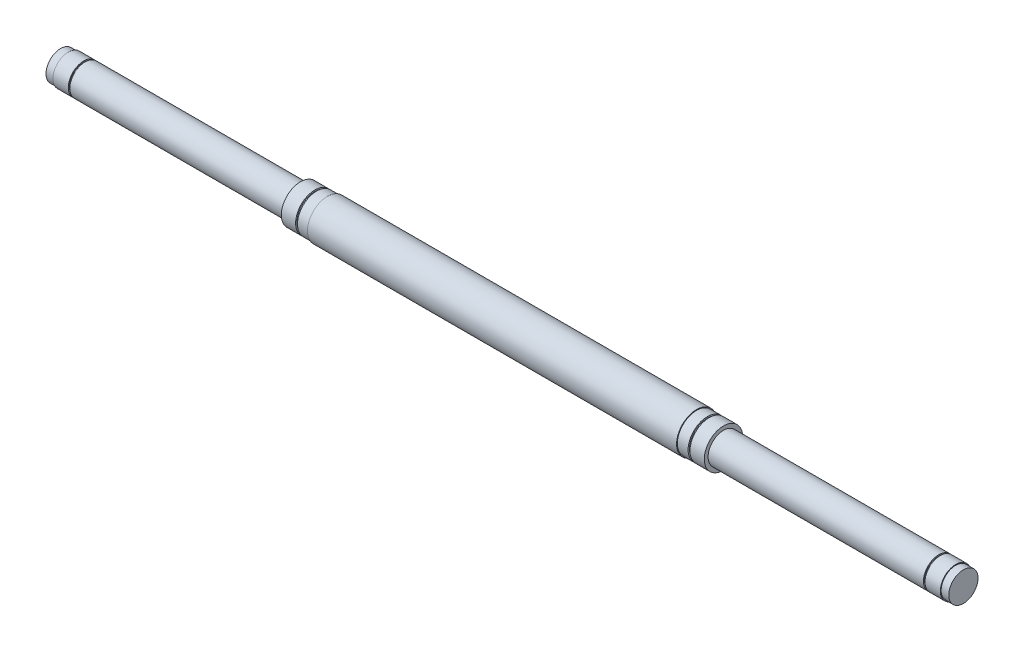
ISO-10303-21;
HEADER;
FILE_DESCRIPTION(('STEP AP214'),'2;1');
FILE_NAME('part.step','',(''),(''),'','','');
FILE_SCHEMA(('AUTOMOTIVE_DESIGN { 1 0 10303 214 1 1 1 1 }'));
ENDSEC;
DATA;
#1=APPLICATION_CONTEXT('core data for automotive mechanical design processes');
#2=APPLICATION_PROTOCOL_DEFINITION('international standard','automotive_design',2000,#1);
#3=PRODUCT_CONTEXT('',#1,'mechanical');
#4=PRODUCT('Part','Part','',(#3));
#5=PRODUCT_RELATED_PRODUCT_CATEGORY('part','',(#4));
#6=PRODUCT_DEFINITION_FORMATION('','',#4);
#7=PRODUCT_DEFINITION_CONTEXT('part definition',#1,'design');
#8=PRODUCT_DEFINITION('design','',#6,#7);
#9=PRODUCT_DEFINITION_SHAPE('','',#8);
#10=(LENGTH_UNIT() NAMED_UNIT(*) SI_UNIT(.MILLI.,.METRE.));
#11=(NAMED_UNIT(*) PLANE_ANGLE_UNIT() SI_UNIT($,.RADIAN.));
#12=(NAMED_UNIT(*) SI_UNIT($,.STERADIAN.) SOLID_ANGLE_UNIT());
#13=UNCERTAINTY_MEASURE_WITH_UNIT(LENGTH_MEASURE(1.E-05),#10,'distance_accuracy_value','');
#14=(GEOMETRIC_REPRESENTATION_CONTEXT(3) GLOBAL_UNCERTAINTY_ASSIGNED_CONTEXT((#13)) GLOBAL_UNIT_ASSIGNED_CONTEXT((#10,
#11,#12)) REPRESENTATION_CONTEXT('',''));
#15=CARTESIAN_POINT('',(0.,0.,0.));
#16=DIRECTION('',(0.,0.,1.));
#17=DIRECTION('',(1.,0.,0.));
#18=AXIS2_PLACEMENT_3D('',#15,#16,#17);
#19=CARTESIAN_POINT('',(587.,0.,-2.53616572187809E-12));
#20=DIRECTION('',(-1.,0.,0.));
#21=DIRECTION('',(0.,0.,1.));
#22=AXIS2_PLACEMENT_3D('',#19,#20,#21);
#23=PLANE('',#22);
#24=CARTESIAN_POINT('',(587.,0.,0.));
#25=DIRECTION('',(-1.,0.,0.));
#26=DIRECTION('',(0.,0.,1.));
#27=AXIS2_PLACEMENT_3D('',#24,#25,#26);
#28=CIRCLE('',#27,9.50000000000254);
#29=CARTESIAN_POINT('',(587.,0.,9.50000000000254));
#30=VERTEX_POINT('',#29);
#31=EDGE_CURVE('E10',#30,#30,#28,.T.);
#32=ORIENTED_EDGE('',*,*,#31,.F.);
#33=EDGE_LOOP('',(#32));
#34=FACE_BOUND('',#33,.T.);
#35=ADVANCED_FACE('F33',(#34),#23,.F.);
#36=CARTESIAN_POINT('',(-75.6129341019927,0.,0.));
#37=DIRECTION('',(-1.,0.,0.));
#38=DIRECTION('',(0.,0.,1.));
#39=AXIS2_PLACEMENT_3D('',#36,#37,#38);
#40=CYLINDRICAL_SURFACE('',#39,9.50000000000252);
#41=CARTESIAN_POINT('',(582.,0.,0.));
#42=DIRECTION('',(-1.,0.,0.));
#43=DIRECTION('',(0.,0.,1.));
#44=AXIS2_PLACEMENT_3D('',#41,#42,#43);
#45=CIRCLE('',#44,9.50000000000249);
#46=CARTESIAN_POINT('',(582.,0.,9.50000000000249));
#47=VERTEX_POINT('',#46);
#48=EDGE_CURVE('E39',#47,#47,#45,.T.);
#49=ORIENTED_EDGE('',*,*,#48,.F.);
#50=EDGE_LOOP('',(#49));
#51=FACE_BOUND('',#50,.T.);
#52=ORIENTED_EDGE('',*,*,#31,.T.);
#53=EDGE_LOOP('',(#52));
#54=FACE_BOUND('',#53,.T.);
#55=ADVANCED_FACE('F297',(#51,#54),#40,.T.);
#56=CARTESIAN_POINT('',(582.,0.,-9.50000000000249));
#57=DIRECTION('',(-1.,0.,0.));
#58=DIRECTION('',(0.,0.,1.));
#59=AXIS2_PLACEMENT_3D('',#56,#57,#58);
#60=PLANE('',#59);
#61=CARTESIAN_POINT('',(582.,0.,0.));
#62=DIRECTION('',(-1.,0.,0.));
#63=DIRECTION('',(0.,0.,1.));
#64=AXIS2_PLACEMENT_3D('',#61,#62,#63);
#65=CIRCLE('',#64,10.0000000000025);
#66=CARTESIAN_POINT('',(582.,0.,10.0000000000025));
#67=VERTEX_POINT('',#66);
#68=EDGE_CURVE('E43',#67,#67,#65,.T.);
#69=ORIENTED_EDGE('',*,*,#68,.F.);
#70=EDGE_LOOP('',(#69));
#71=FACE_BOUND('',#70,.T.);
#72=ORIENTED_EDGE('',*,*,#48,.T.);
#73=EDGE_LOOP('',(#72));
#74=FACE_BOUND('',#73,.T.);
#75=ADVANCED_FACE('F292',(#71,#74),#60,.F.);
#76=CARTESIAN_POINT('',(-75.6129341019927,0.,0.));
#77=DIRECTION('',(-1.,0.,0.));
#78=DIRECTION('',(0.,0.,1.));
#79=AXIS2_PLACEMENT_3D('',#76,#77,#78);
#80=CYLINDRICAL_SURFACE('',#79,10.0000000000025);
#81=CARTESIAN_POINT('',(572.,0.,0.));
#82=DIRECTION('',(-1.,0.,0.));
#83=DIRECTION('',(0.,0.,1.));
#84=AXIS2_PLACEMENT_3D('',#81,#82,#83);
#85=CIRCLE('',#84,10.0000000000024);
#86=CARTESIAN_POINT('',(572.,0.,10.0000000000024));
#87=VERTEX_POINT('',#86);
#88=EDGE_CURVE('E47',#87,#87,#85,.T.);
#89=ORIENTED_EDGE('',*,*,#88,.F.);
#90=EDGE_LOOP('',(#89));
#91=FACE_BOUND('',#90,.T.);
#92=ORIENTED_EDGE('',*,*,#68,.T.);
#93=EDGE_LOOP('',(#92));
#94=FACE_BOUND('',#93,.T.);
#95=ADVANCED_FACE('F286',(#91,#94),#80,.T.);
#96=CARTESIAN_POINT('',(572.,0.,-10.0000000000024));
#97=DIRECTION('',(1.,0.,0.));
#98=DIRECTION('',(0.,0.,-1.));
#99=AXIS2_PLACEMENT_3D('',#96,#97,#98);
#100=PLANE('',#99);
#101=CARTESIAN_POINT('',(572.,0.,0.));
#102=DIRECTION('',(-1.,0.,0.));
#103=DIRECTION('',(0.,0.,1.));
#104=AXIS2_PLACEMENT_3D('',#101,#102,#103);
#105=CIRCLE('',#104,9.25000000000241);
#106=CARTESIAN_POINT('',(572.,0.,9.25000000000241));
#107=VERTEX_POINT('',#106);
#108=EDGE_CURVE('E52',#107,#107,#105,.T.);
#109=ORIENTED_EDGE('',*,*,#108,.F.);
#110=EDGE_LOOP('',(#109));
#111=FACE_BOUND('',#110,.T.);
#112=ORIENTED_EDGE('',*,*,#88,.T.);
#113=EDGE_LOOP('',(#112));
#114=FACE_BOUND('',#113,.T.);
#115=ADVANCED_FACE('F280',(#111,#114),#100,.F.);
#116=CARTESIAN_POINT('',(-75.6129341019927,0.,0.));
#117=DIRECTION('',(-1.,0.,0.));
#118=DIRECTION('',(0.,0.,1.));
#119=AXIS2_PLACEMENT_3D('',#116,#117,#118);
#120=CYLINDRICAL_SURFACE('',#119,9.2500000000024);
#121=CARTESIAN_POINT('',(571.,0.,0.));
#122=DIRECTION('',(-1.,0.,0.));
#123=DIRECTION('',(0.,0.,1.));
#124=AXIS2_PLACEMENT_3D('',#121,#122,#123);
#125=CIRCLE('',#124,9.2500000000024);
#126=CARTESIAN_POINT('',(571.,0.,9.2500000000024));
#127=VERTEX_POINT('',#126);
#128=EDGE_CURVE('E55',#127,#127,#125,.T.);
#129=ORIENTED_EDGE('',*,*,#128,.F.);
#130=EDGE_LOOP('',(#129));
#131=FACE_BOUND('',#130,.T.);
#132=ORIENTED_EDGE('',*,*,#108,.T.);
#133=EDGE_LOOP('',(#132));
#134=FACE_BOUND('',#133,.T.);
#135=ADVANCED_FACE('F274',(#131,#134),#120,.T.);
#136=CARTESIAN_POINT('',(571.,0.,-9.2500000000024));
#137=DIRECTION('',(-1.,0.,0.));
#138=DIRECTION('',(0.,0.,1.));
#139=AXIS2_PLACEMENT_3D('',#136,#137,#138);
#140=PLANE('',#139);
#141=CARTESIAN_POINT('',(571.,0.,0.));
#142=DIRECTION('',(-1.,0.,0.));
#143=DIRECTION('',(0.,0.,1.));
#144=AXIS2_PLACEMENT_3D('',#141,#142,#143);
#145=CIRCLE('',#144,10.0000000000024);
#146=CARTESIAN_POINT('',(571.,0.,10.0000000000024));
#147=VERTEX_POINT('',#146);
#148=EDGE_CURVE('E58',#147,#147,#145,.T.);
#149=ORIENTED_EDGE('',*,*,#148,.F.);
#150=EDGE_LOOP('',(#149));
#151=FACE_BOUND('',#150,.T.);
#152=ORIENTED_EDGE('',*,*,#128,.T.);
#153=EDGE_LOOP('',(#152));
#154=FACE_BOUND('',#153,.T.);
#155=ADVANCED_FACE('F268',(#151,#154),#140,.F.);
#156=CARTESIAN_POINT('',(-75.6129341019927,0.,0.));
#157=DIRECTION('',(-1.,0.,0.));
#158=DIRECTION('',(0.,0.,1.));
#159=AXIS2_PLACEMENT_3D('',#156,#157,#158);
#160=CYLINDRICAL_SURFACE('',#159,10.0000000000018);
#161=CARTESIAN_POINT('',(431.,0.,0.));
#162=DIRECTION('',(-1.,0.,0.));
#163=DIRECTION('',(0.,0.,1.));
#164=AXIS2_PLACEMENT_3D('',#161,#162,#163);
#165=CIRCLE('',#164,10.0000000000012);
#166=CARTESIAN_POINT('',(431.,0.,10.0000000000012));
#167=VERTEX_POINT('',#166);
#168=EDGE_CURVE('E61',#167,#167,#165,.T.);
#169=ORIENTED_EDGE('',*,*,#168,.F.);
#170=EDGE_LOOP('',(#169));
#171=FACE_BOUND('',#170,.T.);
#172=ORIENTED_EDGE('',*,*,#148,.T.);
#173=EDGE_LOOP('',(#172));
#174=FACE_BOUND('',#173,.T.);
#175=ADVANCED_FACE('F262',(#171,#174),#160,.T.);
#176=CARTESIAN_POINT('',(431.,0.,-10.0000000000012));
#177=DIRECTION('',(-1.,0.,0.));
#178=DIRECTION('',(0.,0.,1.));
#179=AXIS2_PLACEMENT_3D('',#176,#177,#178);
#180=PLANE('',#179);
#181=CARTESIAN_POINT('',(431.,0.,0.));
#182=DIRECTION('',(-1.,0.,0.));
#183=DIRECTION('',(0.,0.,1.));
#184=AXIS2_PLACEMENT_3D('',#181,#182,#183);
#185=CIRCLE('',#184,12.5000000000012);
#186=CARTESIAN_POINT('',(431.,0.,12.5000000000012));
#187=VERTEX_POINT('',#186);
#188=EDGE_CURVE('E64',#187,#187,#185,.T.);
#189=ORIENTED_EDGE('',*,*,#188,.F.);
#190=EDGE_LOOP('',(#189));
#191=FACE_BOUND('',#190,.T.);
#192=ORIENTED_EDGE('',*,*,#168,.T.);
#193=EDGE_LOOP('',(#192));
#194=FACE_BOUND('',#193,.T.);
#195=ADVANCED_FACE('F256',(#191,#194),#180,.F.);
#196=CARTESIAN_POINT('',(-75.6129341019927,0.,0.));
#197=DIRECTION('',(-1.,0.,0.));
#198=DIRECTION('',(0.,0.,1.));
#199=AXIS2_PLACEMENT_3D('',#196,#197,#198);
#200=CYLINDRICAL_SURFACE('',#199,12.5000000000011);
#201=CARTESIAN_POINT('',(421.7,0.,0.));
#202=DIRECTION('',(-1.,0.,0.));
#203=DIRECTION('',(0.,0.,1.));
#204=AXIS2_PLACEMENT_3D('',#201,#202,#203);
#205=CIRCLE('',#204,12.5000000000011);
#206=CARTESIAN_POINT('',(421.7,0.,12.5000000000011));
#207=VERTEX_POINT('',#206);
#208=EDGE_CURVE('E67',#207,#207,#205,.T.);
#209=ORIENTED_EDGE('',*,*,#208,.F.);
#210=EDGE_LOOP('',(#209));
#211=FACE_BOUND('',#210,.T.);
#212=ORIENTED_EDGE('',*,*,#188,.T.);
#213=EDGE_LOOP('',(#212));
#214=FACE_BOUND('',#213,.T.);
#215=ADVANCED_FACE('F250',(#211,#214),#200,.T.);
#216=CARTESIAN_POINT('',(421.7,0.,-12.5000000000011));
#217=DIRECTION('',(1.,0.,0.));
#218=DIRECTION('',(0.,0.,-1.));
#219=AXIS2_PLACEMENT_3D('',#216,#217,#218);
#220=PLANE('',#219);
#221=CARTESIAN_POINT('',(421.7,0.,0.));
#222=DIRECTION('',(-1.,0.,0.));
#223=DIRECTION('',(0.,0.,1.));
#224=AXIS2_PLACEMENT_3D('',#221,#222,#223);
#225=CIRCLE('',#224,11.6000000000011);
#226=CARTESIAN_POINT('',(421.7,0.,11.6000000000011));
#227=VERTEX_POINT('',#226);
#228=EDGE_CURVE('E70',#227,#227,#225,.T.);
#229=ORIENTED_EDGE('',*,*,#228,.F.);
#230=EDGE_LOOP('',(#229));
#231=FACE_BOUND('',#230,.T.);
#232=ORIENTED_EDGE('',*,*,#208,.T.);
#233=EDGE_LOOP('',(#232));
#234=FACE_BOUND('',#233,.T.);
#235=ADVANCED_FACE('F244',(#231,#234),#220,.F.);
#236=CARTESIAN_POINT('',(-75.6129341019927,0.,0.));
#237=DIRECTION('',(-1.,0.,0.));
#238=DIRECTION('',(0.,0.,1.));
#239=AXIS2_PLACEMENT_3D('',#236,#237,#238);
#240=CYLINDRICAL_SURFACE('',#239,11.6000000000011);
#241=CARTESIAN_POINT('',(420.5,0.,0.));
#242=DIRECTION('',(-1.,0.,0.));
#243=DIRECTION('',(0.,0.,1.));
#244=AXIS2_PLACEMENT_3D('',#241,#242,#243);
#245=CIRCLE('',#244,11.6000000000011);
#246=CARTESIAN_POINT('',(420.5,0.,11.6000000000011));
#247=VERTEX_POINT('',#246);
#248=EDGE_CURVE('E73',#247,#247,#245,.T.);
#249=ORIENTED_EDGE('',*,*,#248,.F.);
#250=EDGE_LOOP('',(#249));
#251=FACE_BOUND('',#250,.T.);
#252=ORIENTED_EDGE('',*,*,#228,.T.);
#253=EDGE_LOOP('',(#252));
#254=FACE_BOUND('',#253,.T.);
#255=ADVANCED_FACE('F238',(#251,#254),#240,.T.);
#256=CARTESIAN_POINT('',(420.5,0.,-11.6000000000011));
#257=DIRECTION('',(-1.,0.,0.));
#258=DIRECTION('',(0.,0.,1.));
#259=AXIS2_PLACEMENT_3D('',#256,#257,#258);
#260=PLANE('',#259);
#261=CARTESIAN_POINT('',(420.5,0.,0.));
#262=DIRECTION('',(-1.,0.,0.));
#263=DIRECTION('',(0.,0.,1.));
#264=AXIS2_PLACEMENT_3D('',#261,#262,#263);
#265=CIRCLE('',#264,12.5000000000011);
#266=CARTESIAN_POINT('',(420.5,0.,12.5000000000011));
#267=VERTEX_POINT('',#266);
#268=EDGE_CURVE('E76',#267,#267,#265,.T.);
#269=ORIENTED_EDGE('',*,*,#268,.F.);
#270=EDGE_LOOP('',(#269));
#271=FACE_BOUND('',#270,.T.);
#272=ORIENTED_EDGE('',*,*,#248,.T.);
#273=EDGE_LOOP('',(#272));
#274=FACE_BOUND('',#273,.T.);
#275=ADVANCED_FACE('F232',(#271,#274),#260,.F.);
#276=CARTESIAN_POINT('',(-75.6129341019927,0.,0.));
#277=DIRECTION('',(-1.,0.,0.));
#278=DIRECTION('',(0.,0.,1.));
#279=AXIS2_PLACEMENT_3D('',#276,#277,#278);
#280=CYLINDRICAL_SURFACE('',#279,12.5000000000011);
#281=CARTESIAN_POINT('',(413.5,0.,0.));
#282=DIRECTION('',(-1.,0.,0.));
#283=DIRECTION('',(0.,0.,1.));
#284=AXIS2_PLACEMENT_3D('',#281,#282,#283);
#285=CIRCLE('',#284,12.500000000001);
#286=CARTESIAN_POINT('',(413.5,0.,12.500000000001));
#287=VERTEX_POINT('',#286);
#288=EDGE_CURVE('E79',#287,#287,#285,.T.);
#289=ORIENTED_EDGE('',*,*,#288,.F.);
#290=EDGE_LOOP('',(#289));
#291=FACE_BOUND('',#290,.T.);
#292=ORIENTED_EDGE('',*,*,#268,.T.);
#293=EDGE_LOOP('',(#292));
#294=FACE_BOUND('',#293,.T.);
#295=ADVANCED_FACE('F226',(#291,#294),#280,.T.);
#296=CARTESIAN_POINT('',(413.5,0.,-12.500000000001));
#297=DIRECTION('',(-1.,0.,0.));
#298=DIRECTION('',(0.,0.,1.));
#299=AXIS2_PLACEMENT_3D('',#296,#297,#298);
#300=PLANE('',#299);
#301=CARTESIAN_POINT('',(413.5,0.,0.));
#302=DIRECTION('',(-1.,0.,0.));
#303=DIRECTION('',(0.,0.,1.));
#304=AXIS2_PLACEMENT_3D('',#301,#302,#303);
#305=CIRCLE('',#304,13.000000000001);
#306=CARTESIAN_POINT('',(413.5,0.,13.000000000001));
#307=VERTEX_POINT('',#306);
#308=EDGE_CURVE('E82',#307,#307,#305,.T.);
#309=ORIENTED_EDGE('',*,*,#308,.F.);
#310=EDGE_LOOP('',(#309));
#311=FACE_BOUND('',#310,.T.);
#312=ORIENTED_EDGE('',*,*,#288,.T.);
#313=EDGE_LOOP('',(#312));
#314=FACE_BOUND('',#313,.T.);
#315=ADVANCED_FACE('F220',(#311,#314),#300,.F.);
#316=CARTESIAN_POINT('',(-75.6129341019927,0.,0.));
#317=DIRECTION('',(-1.,0.,0.));
#318=DIRECTION('',(0.,0.,1.));
#319=AXIS2_PLACEMENT_3D('',#316,#317,#318);
#320=CYLINDRICAL_SURFACE('',#319,13.0000000000005);
#321=CARTESIAN_POINT('',(173.5,0.,0.));
#322=DIRECTION('',(-1.,0.,0.));
#323=DIRECTION('',(0.,0.,1.));
#324=AXIS2_PLACEMENT_3D('',#321,#322,#323);
#325=CIRCLE('',#324,13.);
#326=CARTESIAN_POINT('',(173.5,0.,13.));
#327=VERTEX_POINT('',#326);
#328=EDGE_CURVE('E85',#327,#327,#325,.T.);
#329=ORIENTED_EDGE('',*,*,#328,.F.);
#330=EDGE_LOOP('',(#329));
#331=FACE_BOUND('',#330,.T.);
#332=ORIENTED_EDGE('',*,*,#308,.T.);
#333=EDGE_LOOP('',(#332));
#334=FACE_BOUND('',#333,.T.);
#335=ADVANCED_FACE('F214',(#331,#334),#320,.T.);
#336=CARTESIAN_POINT('',(173.5,0.,-12.5));
#337=DIRECTION('',(1.,0.,0.));
#338=DIRECTION('',(0.,0.,-1.));
#339=AXIS2_PLACEMENT_3D('',#336,#337,#338);
#340=PLANE('',#339);
#341=CARTESIAN_POINT('',(173.5,0.,0.));
#342=DIRECTION('',(-1.,0.,0.));
#343=DIRECTION('',(0.,0.,1.));
#344=AXIS2_PLACEMENT_3D('',#341,#342,#343);
#345=CIRCLE('',#344,12.5);
#346=CARTESIAN_POINT('',(173.5,0.,12.5));
#347=VERTEX_POINT('',#346);
#348=EDGE_CURVE('E88',#347,#347,#345,.T.);
#349=ORIENTED_EDGE('',*,*,#348,.F.);
#350=EDGE_LOOP('',(#349));
#351=FACE_BOUND('',#350,.T.);
#352=ORIENTED_EDGE('',*,*,#328,.T.);
#353=EDGE_LOOP('',(#352));
#354=FACE_BOUND('',#353,.T.);
#355=ADVANCED_FACE('F208',(#351,#354),#340,.F.);
#356=CARTESIAN_POINT('',(-75.6129341019927,0.,0.));
#357=DIRECTION('',(-1.,0.,0.));
#358=DIRECTION('',(0.,0.,1.));
#359=AXIS2_PLACEMENT_3D('',#356,#357,#358);
#360=CYLINDRICAL_SURFACE('',#359,12.5);
#361=CARTESIAN_POINT('',(166.5,0.,0.));
#362=DIRECTION('',(-1.,0.,0.));
#363=DIRECTION('',(0.,0.,1.));
#364=AXIS2_PLACEMENT_3D('',#361,#362,#363);
#365=CIRCLE('',#364,12.5);
#366=CARTESIAN_POINT('',(166.5,0.,12.5));
#367=VERTEX_POINT('',#366);
#368=EDGE_CURVE('E91',#367,#367,#365,.T.);
#369=ORIENTED_EDGE('',*,*,#368,.F.);
#370=EDGE_LOOP('',(#369));
#371=FACE_BOUND('',#370,.T.);
#372=ORIENTED_EDGE('',*,*,#348,.T.);
#373=EDGE_LOOP('',(#372));
#374=FACE_BOUND('',#373,.T.);
#375=ADVANCED_FACE('F202',(#371,#374),#360,.T.);
#376=CARTESIAN_POINT('',(166.5,0.,-11.6));
#377=DIRECTION('',(1.,0.,0.));
#378=DIRECTION('',(0.,0.,-1.));
#379=AXIS2_PLACEMENT_3D('',#376,#377,#378);
#380=PLANE('',#379);
#381=CARTESIAN_POINT('',(166.5,0.,0.));
#382=DIRECTION('',(-1.,0.,0.));
#383=DIRECTION('',(0.,0.,1.));
#384=AXIS2_PLACEMENT_3D('',#381,#382,#383);
#385=CIRCLE('',#384,11.6);
#386=CARTESIAN_POINT('',(166.5,0.,11.6));
#387=VERTEX_POINT('',#386);
#388=EDGE_CURVE('E94',#387,#387,#385,.T.);
#389=ORIENTED_EDGE('',*,*,#388,.F.);
#390=EDGE_LOOP('',(#389));
#391=FACE_BOUND('',#390,.T.);
#392=ORIENTED_EDGE('',*,*,#368,.T.);
#393=EDGE_LOOP('',(#392));
#394=FACE_BOUND('',#393,.T.);
#395=ADVANCED_FACE('F196',(#391,#394),#380,.F.);
#396=CARTESIAN_POINT('',(-75.6129341019927,0.,0.));
#397=DIRECTION('',(-1.,0.,0.));
#398=DIRECTION('',(0.,0.,1.));
#399=AXIS2_PLACEMENT_3D('',#396,#397,#398);
#400=CYLINDRICAL_SURFACE('',#399,11.6);
#401=CARTESIAN_POINT('',(165.3,0.,0.));
#402=DIRECTION('',(-1.,0.,0.));
#403=DIRECTION('',(0.,0.,1.));
#404=AXIS2_PLACEMENT_3D('',#401,#402,#403);
#405=CIRCLE('',#404,11.6);
#406=CARTESIAN_POINT('',(165.3,0.,11.6));
#407=VERTEX_POINT('',#406);
#408=EDGE_CURVE('E97',#407,#407,#405,.T.);
#409=ORIENTED_EDGE('',*,*,#408,.F.);
#410=EDGE_LOOP('',(#409));
#411=FACE_BOUND('',#410,.T.);
#412=ORIENTED_EDGE('',*,*,#388,.T.);
#413=EDGE_LOOP('',(#412));
#414=FACE_BOUND('',#413,.T.);
#415=ADVANCED_FACE('F190',(#411,#414),#400,.T.);
#416=CARTESIAN_POINT('',(165.3,0.,-12.5));
#417=DIRECTION('',(-1.,0.,0.));
#418=DIRECTION('',(0.,0.,1.));
#419=AXIS2_PLACEMENT_3D('',#416,#417,#418);
#420=PLANE('',#419);
#421=CARTESIAN_POINT('',(165.3,0.,0.));
#422=DIRECTION('',(-1.,0.,0.));
#423=DIRECTION('',(0.,0.,1.));
#424=AXIS2_PLACEMENT_3D('',#421,#422,#423);
#425=CIRCLE('',#424,12.5);
#426=CARTESIAN_POINT('',(165.3,0.,12.5));
#427=VERTEX_POINT('',#426);
#428=EDGE_CURVE('E100',#427,#427,#425,.T.);
#429=ORIENTED_EDGE('',*,*,#428,.F.);
#430=EDGE_LOOP('',(#429));
#431=FACE_BOUND('',#430,.T.);
#432=ORIENTED_EDGE('',*,*,#408,.T.);
#433=EDGE_LOOP('',(#432));
#434=FACE_BOUND('',#433,.T.);
#435=ADVANCED_FACE('F184',(#431,#434),#420,.F.);
#436=CARTESIAN_POINT('',(-75.6129341019927,0.,0.));
#437=DIRECTION('',(-1.,0.,0.));
#438=DIRECTION('',(0.,0.,1.));
#439=AXIS2_PLACEMENT_3D('',#436,#437,#438);
#440=CYLINDRICAL_SURFACE('',#439,12.5);
#441=CARTESIAN_POINT('',(156.,0.,0.));
#442=DIRECTION('',(-1.,0.,0.));
#443=DIRECTION('',(0.,0.,1.));
#444=AXIS2_PLACEMENT_3D('',#441,#442,#443);
#445=CIRCLE('',#444,12.5);
#446=CARTESIAN_POINT('',(156.,0.,12.5));
#447=VERTEX_POINT('',#446);
#448=EDGE_CURVE('E103',#447,#447,#445,.T.);
#449=ORIENTED_EDGE('',*,*,#448,.F.);
#450=EDGE_LOOP('',(#449));
#451=FACE_BOUND('',#450,.T.);
#452=ORIENTED_EDGE('',*,*,#428,.T.);
#453=EDGE_LOOP('',(#452));
#454=FACE_BOUND('',#453,.T.);
#455=ADVANCED_FACE('F178',(#451,#454),#440,.T.);
#456=CARTESIAN_POINT('',(156.,0.,-10.));
#457=DIRECTION('',(1.,0.,0.));
#458=DIRECTION('',(0.,0.,-1.));
#459=AXIS2_PLACEMENT_3D('',#456,#457,#458);
#460=PLANE('',#459);
#461=CARTESIAN_POINT('',(156.,0.,0.));
#462=DIRECTION('',(-1.,0.,0.));
#463=DIRECTION('',(0.,0.,1.));
#464=AXIS2_PLACEMENT_3D('',#461,#462,#463);
#465=CIRCLE('',#464,10.);
#466=CARTESIAN_POINT('',(156.,0.,10.));
#467=VERTEX_POINT('',#466);
#468=EDGE_CURVE('E106',#467,#467,#465,.T.);
#469=ORIENTED_EDGE('',*,*,#468,.F.);
#470=EDGE_LOOP('',(#469));
#471=FACE_BOUND('',#470,.T.);
#472=ORIENTED_EDGE('',*,*,#448,.T.);
#473=EDGE_LOOP('',(#472));
#474=FACE_BOUND('',#473,.T.);
#475=ADVANCED_FACE('F172',(#471,#474),#460,.F.);
#476=CARTESIAN_POINT('',(-75.6129341019927,0.,0.));
#477=DIRECTION('',(-1.,0.,0.));
#478=DIRECTION('',(0.,0.,1.));
#479=AXIS2_PLACEMENT_3D('',#476,#477,#478);
#480=CYLINDRICAL_SURFACE('',#479,10.);
#481=CARTESIAN_POINT('',(16.,0.,0.));
#482=DIRECTION('',(-1.,0.,0.));
#483=DIRECTION('',(0.,0.,1.));
#484=AXIS2_PLACEMENT_3D('',#481,#482,#483);
#485=CIRCLE('',#484,10.);
#486=CARTESIAN_POINT('',(16.,0.,10.));
#487=VERTEX_POINT('',#486);
#488=EDGE_CURVE('E109',#487,#487,#485,.T.);
#489=ORIENTED_EDGE('',*,*,#488,.F.);
#490=EDGE_LOOP('',(#489));
#491=FACE_BOUND('',#490,.T.);
#492=ORIENTED_EDGE('',*,*,#468,.T.);
#493=EDGE_LOOP('',(#492));
#494=FACE_BOUND('',#493,.T.);
#495=ADVANCED_FACE('F166',(#491,#494),#480,.T.);
#496=CARTESIAN_POINT('',(16.,0.,-9.25));
#497=DIRECTION('',(1.,0.,0.));
#498=DIRECTION('',(0.,0.,-1.));
#499=AXIS2_PLACEMENT_3D('',#496,#497,#498);
#500=PLANE('',#499);
#501=CARTESIAN_POINT('',(16.,0.,0.));
#502=DIRECTION('',(-1.,0.,0.));
#503=DIRECTION('',(0.,0.,1.));
#504=AXIS2_PLACEMENT_3D('',#501,#502,#503);
#505=CIRCLE('',#504,9.25);
#506=CARTESIAN_POINT('',(16.,0.,9.25));
#507=VERTEX_POINT('',#506);
#508=EDGE_CURVE('E112',#507,#507,#505,.T.);
#509=ORIENTED_EDGE('',*,*,#508,.F.);
#510=EDGE_LOOP('',(#509));
#511=FACE_BOUND('',#510,.T.);
#512=ORIENTED_EDGE('',*,*,#488,.T.);
#513=EDGE_LOOP('',(#512));
#514=FACE_BOUND('',#513,.T.);
#515=ADVANCED_FACE('F160',(#511,#514),#500,.F.);
#516=CARTESIAN_POINT('',(-75.6129341019927,0.,0.));
#517=DIRECTION('',(-1.,0.,0.));
#518=DIRECTION('',(0.,0.,1.));
#519=AXIS2_PLACEMENT_3D('',#516,#517,#518);
#520=CYLINDRICAL_SURFACE('',#519,9.25);
#521=CARTESIAN_POINT('',(15.,0.,0.));
#522=DIRECTION('',(-1.,0.,0.));
#523=DIRECTION('',(0.,0.,1.));
#524=AXIS2_PLACEMENT_3D('',#521,#522,#523);
#525=CIRCLE('',#524,9.25);
#526=CARTESIAN_POINT('',(15.,0.,9.25));
#527=VERTEX_POINT('',#526);
#528=EDGE_CURVE('E115',#527,#527,#525,.T.);
#529=ORIENTED_EDGE('',*,*,#528,.F.);
#530=EDGE_LOOP('',(#529));
#531=FACE_BOUND('',#530,.T.);
#532=ORIENTED_EDGE('',*,*,#508,.T.);
#533=EDGE_LOOP('',(#532));
#534=FACE_BOUND('',#533,.T.);
#535=ADVANCED_FACE('F154',(#531,#534),#520,.T.);
#536=CARTESIAN_POINT('',(15.,0.,-10.));
#537=DIRECTION('',(-1.,0.,0.));
#538=DIRECTION('',(0.,0.,1.));
#539=AXIS2_PLACEMENT_3D('',#536,#537,#538);
#540=PLANE('',#539);
#541=CARTESIAN_POINT('',(15.,0.,0.));
#542=DIRECTION('',(-1.,0.,0.));
#543=DIRECTION('',(0.,0.,1.));
#544=AXIS2_PLACEMENT_3D('',#541,#542,#543);
#545=CIRCLE('',#544,10.);
#546=CARTESIAN_POINT('',(15.,0.,10.));
#547=VERTEX_POINT('',#546);
#548=EDGE_CURVE('E118',#547,#547,#545,.T.);
#549=ORIENTED_EDGE('',*,*,#548,.F.);
#550=EDGE_LOOP('',(#549));
#551=FACE_BOUND('',#550,.T.);
#552=ORIENTED_EDGE('',*,*,#528,.T.);
#553=EDGE_LOOP('',(#552));
#554=FACE_BOUND('',#553,.T.);
#555=ADVANCED_FACE('F148',(#551,#554),#540,.F.);
#556=CARTESIAN_POINT('',(-75.6129341019927,0.,0.));
#557=DIRECTION('',(-1.,0.,0.));
#558=DIRECTION('',(0.,0.,1.));
#559=AXIS2_PLACEMENT_3D('',#556,#557,#558);
#560=CYLINDRICAL_SURFACE('',#559,10.);
#561=CARTESIAN_POINT('',(5.,0.,0.));
#562=DIRECTION('',(-1.,0.,0.));
#563=DIRECTION('',(0.,0.,1.));
#564=AXIS2_PLACEMENT_3D('',#561,#562,#563);
#565=CIRCLE('',#564,10.);
#566=CARTESIAN_POINT('',(5.,0.,10.));
#567=VERTEX_POINT('',#566);
#568=EDGE_CURVE('E121',#567,#567,#565,.T.);
#569=ORIENTED_EDGE('',*,*,#568,.F.);
#570=EDGE_LOOP('',(#569));
#571=FACE_BOUND('',#570,.T.);
#572=ORIENTED_EDGE('',*,*,#548,.T.);
#573=EDGE_LOOP('',(#572));
#574=FACE_BOUND('',#573,.T.);
#575=ADVANCED_FACE('F142',(#571,#574),#560,.T.);
#576=CARTESIAN_POINT('',(5.00000000000001,0.,-9.5));
#577=DIRECTION('',(1.,0.,0.));
#578=DIRECTION('',(0.,0.,-1.));
#579=AXIS2_PLACEMENT_3D('',#576,#577,#578);
#580=PLANE('',#579);
#581=CARTESIAN_POINT('',(5.,0.,0.));
#582=DIRECTION('',(-1.,0.,0.));
#583=DIRECTION('',(0.,0.,1.));
#584=AXIS2_PLACEMENT_3D('',#581,#582,#583);
#585=CIRCLE('',#584,9.5);
#586=CARTESIAN_POINT('',(5.,0.,9.5));
#587=VERTEX_POINT('',#586);
#588=EDGE_CURVE('E124',#587,#587,#585,.T.);
#589=ORIENTED_EDGE('',*,*,#588,.F.);
#590=EDGE_LOOP('',(#589));
#591=FACE_BOUND('',#590,.T.);
#592=ORIENTED_EDGE('',*,*,#568,.T.);
#593=EDGE_LOOP('',(#592));
#594=FACE_BOUND('',#593,.T.);
#595=ADVANCED_FACE('F136',(#591,#594),#580,.F.);
#596=CARTESIAN_POINT('',(-75.6129341019927,0.,0.));
#597=DIRECTION('',(-1.,0.,0.));
#598=DIRECTION('',(0.,0.,1.));
#599=AXIS2_PLACEMENT_3D('',#596,#597,#598);
#600=CYLINDRICAL_SURFACE('',#599,9.5);
#601=CARTESIAN_POINT('',(0.,0.,0.));
#602=DIRECTION('',(-1.,0.,0.));
#603=DIRECTION('',(0.,0.,1.));
#604=AXIS2_PLACEMENT_3D('',#601,#602,#603);
#605=CIRCLE('',#604,9.5);
#606=CARTESIAN_POINT('',(0.,0.,9.5));
#607=VERTEX_POINT('',#606);
#608=EDGE_CURVE('E127',#607,#607,#605,.T.);
#609=ORIENTED_EDGE('',*,*,#608,.F.);
#610=EDGE_LOOP('',(#609));
#611=FACE_BOUND('',#610,.T.);
#612=ORIENTED_EDGE('',*,*,#588,.T.);
#613=EDGE_LOOP('',(#612));
#614=FACE_BOUND('',#613,.T.);
#615=ADVANCED_FACE('F133',(#611,#614),#600,.T.);
#616=CARTESIAN_POINT('',(0.,0.,0.));
#617=DIRECTION('',(1.,0.,0.));
#618=DIRECTION('',(0.,0.,-1.));
#619=AXIS2_PLACEMENT_3D('',#616,#617,#618);
#620=PLANE('',#619);
#621=ORIENTED_EDGE('',*,*,#608,.T.);
#622=EDGE_LOOP('',(#621));
#623=FACE_BOUND('',#622,.T.);
#624=ADVANCED_FACE('F131',(#623),#620,.F.);
#625=CLOSED_SHELL('',(#35,#55,#75,#95,#115,#135,#155,#175,#195,#215,#235,#255,#275,#295,#315,
#335,#355,#375,#395,#415,#435,#455,#475,#495,#515,#535,#555,#575,#595,#615,#624));
#626=MANIFOLD_SOLID_BREP('B2',#625);
#627=ADVANCED_BREP_SHAPE_REPRESENTATION('',(#18,#626),#14);
#628=SHAPE_DEFINITION_REPRESENTATION(#9,#627);
ENDSEC;
END-ISO-10303-21;
